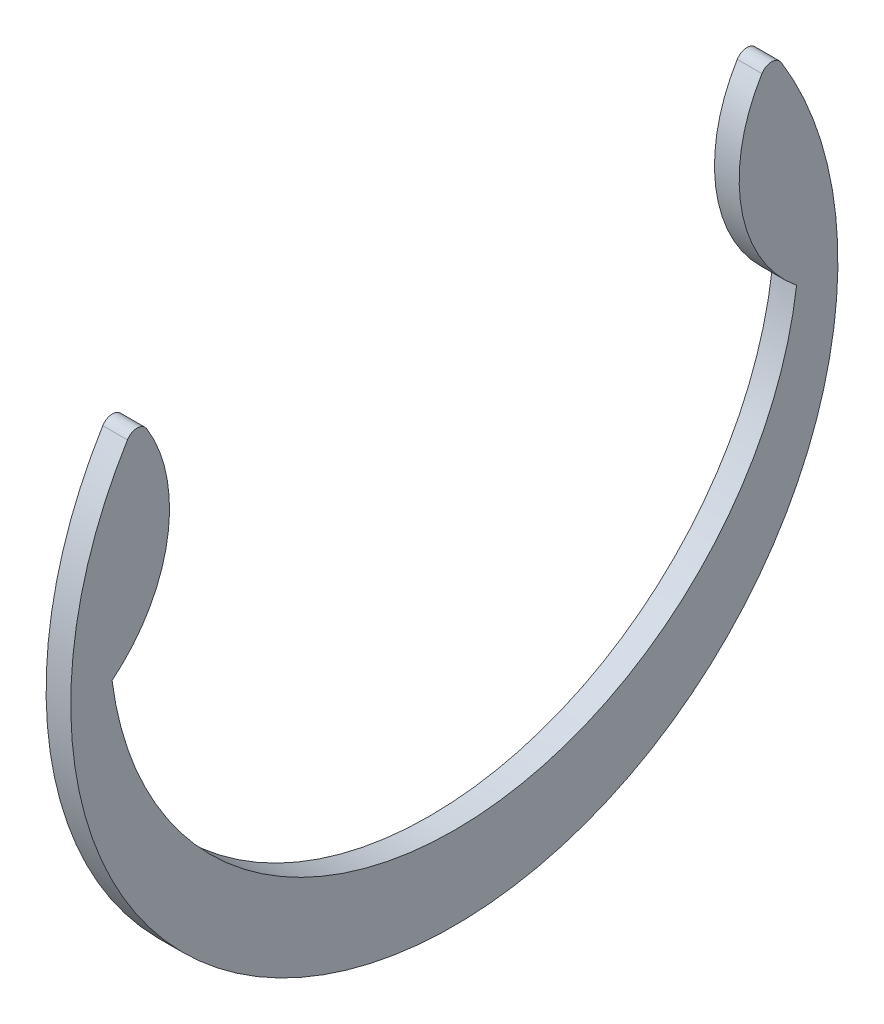
ISO-10303-21;
HEADER;
FILE_DESCRIPTION(('STEP AP214'),'2;1');
FILE_NAME('part.step','',(''),(''),'','','');
FILE_SCHEMA(('AUTOMOTIVE_DESIGN { 1 0 10303 214 1 1 1 1 }'));
ENDSEC;
DATA;
#1=APPLICATION_CONTEXT('core data for automotive mechanical design processes');
#2=APPLICATION_PROTOCOL_DEFINITION('international standard','automotive_design',2000,#1);
#3=PRODUCT_CONTEXT('',#1,'mechanical');
#4=PRODUCT('Part','Part','',(#3));
#5=PRODUCT_RELATED_PRODUCT_CATEGORY('part','',(#4));
#6=PRODUCT_DEFINITION_FORMATION('','',#4);
#7=PRODUCT_DEFINITION_CONTEXT('part definition',#1,'design');
#8=PRODUCT_DEFINITION('design','',#6,#7);
#9=PRODUCT_DEFINITION_SHAPE('','',#8);
#10=(LENGTH_UNIT() NAMED_UNIT(*) SI_UNIT(.MILLI.,.METRE.));
#11=(NAMED_UNIT(*) PLANE_ANGLE_UNIT() SI_UNIT($,.RADIAN.));
#12=(NAMED_UNIT(*) SI_UNIT($,.STERADIAN.) SOLID_ANGLE_UNIT());
#13=UNCERTAINTY_MEASURE_WITH_UNIT(LENGTH_MEASURE(1.E-05),#10,'distance_accuracy_value','');
#14=(GEOMETRIC_REPRESENTATION_CONTEXT(3) GLOBAL_UNCERTAINTY_ASSIGNED_CONTEXT((#13)) GLOBAL_UNIT_ASSIGNED_CONTEXT((#10,
#11,#12)) REPRESENTATION_CONTEXT('',''));
#15=CARTESIAN_POINT('',(0.,0.,0.));
#16=DIRECTION('',(0.,0.,1.));
#17=DIRECTION('',(1.,0.,0.));
#18=AXIS2_PLACEMENT_3D('',#15,#16,#17);
#19=CARTESIAN_POINT('',(0.635,6.17944168403095,22.5999861970108));
#20=DIRECTION('',(-1.,0.,0.));
#21=DIRECTION('',(0.,0.,1.));
#22=AXIS2_PLACEMENT_3D('',#19,#20,#21);
#23=CYLINDRICAL_SURFACE('',#22,7.93557267282992);
#24=CARTESIAN_POINT('',(-0.635,6.17944168403095,22.5999861970108));
#25=DIRECTION('',(1.,0.,0.));
#26=DIRECTION('',(0.,0.,1.));
#27=AXIS2_PLACEMENT_3D('',#24,#25,#26);
#28=CIRCLE('',#27,7.93557267282992);
#29=CARTESIAN_POINT('',(-0.635,0.,17.62125));
#30=VERTEX_POINT('',#29);
#31=CARTESIAN_POINT('',(-0.635,10.3292728157641,15.8359478156987));
#32=VERTEX_POINT('',#31);
#33=EDGE_CURVE('E120',#30,#32,#28,.T.);
#34=ORIENTED_EDGE('',*,*,#33,.T.);
#35=DIRECTION('',(-1.,0.,0.));
#36=VECTOR('',#35,1.);
#37=CARTESIAN_POINT('',(0.635,10.3292728157641,15.8359478156987));
#38=LINE('',#37,#36);
#39=CARTESIAN_POINT('',(0.635,10.3292728157641,15.8359478156987));
#40=VERTEX_POINT('',#39);
#41=EDGE_CURVE('E11',#40,#32,#38,.T.);
#42=ORIENTED_EDGE('',*,*,#41,.F.);
#43=CARTESIAN_POINT('',(0.635,6.17944168403095,22.5999861970108));
#44=DIRECTION('',(1.,0.,0.));
#45=DIRECTION('',(0.,0.,1.));
#46=AXIS2_PLACEMENT_3D('',#43,#44,#45);
#47=CIRCLE('',#46,7.93557267282992);
#48=CARTESIAN_POINT('',(0.635,0.,17.62125));
#49=VERTEX_POINT('',#48);
#50=EDGE_CURVE('E130',#49,#40,#47,.T.);
#51=ORIENTED_EDGE('',*,*,#50,.F.);
#52=DIRECTION('',(-1.,0.,0.));
#53=VECTOR('',#52,1.);
#54=CARTESIAN_POINT('',(0.635,0.,17.62125));
#55=LINE('',#54,#53);
#56=EDGE_CURVE('E116',#49,#30,#55,.T.);
#57=ORIENTED_EDGE('',*,*,#56,.T.);
#58=EDGE_LOOP('',(#34,#42,#51,#57));
#59=FACE_BOUND('',#58,.T.);
#60=ADVANCED_FACE('F36',(#59),#23,.T.);
#61=CARTESIAN_POINT('',(0.635,10.023789326672,16.3338721840604));
#62=DIRECTION('',(-1.,0.,0.));
#63=DIRECTION('',(0.,0.,1.));
#64=AXIS2_PLACEMENT_3D('',#61,#62,#63);
#65=CYLINDRICAL_SURFACE('',#64,0.584165078309483);
#66=CARTESIAN_POINT('',(-0.635,10.023789326672,16.3338721840604));
#67=DIRECTION('',(1.,0.,0.));
#68=DIRECTION('',(0.,0.,1.));
#69=AXIS2_PLACEMENT_3D('',#66,#67,#68);
#70=CIRCLE('',#69,0.584165078309483);
#71=CARTESIAN_POINT('',(-0.635,10.3293333333333,16.8317594189939));
#72=VERTEX_POINT('',#71);
#73=EDGE_CURVE('E123',#32,#72,#70,.T.);
#74=ORIENTED_EDGE('',*,*,#73,.T.);
#75=DIRECTION('',(-1.,0.,0.));
#76=VECTOR('',#75,1.);
#77=CARTESIAN_POINT('',(0.635,10.3293333333333,16.8317594189939));
#78=LINE('',#77,#76);
#79=CARTESIAN_POINT('',(0.635,10.3293333333333,16.8317594189939));
#80=VERTEX_POINT('',#79);
#81=EDGE_CURVE('E44',#80,#72,#78,.T.);
#82=ORIENTED_EDGE('',*,*,#81,.F.);
#83=CARTESIAN_POINT('',(0.635,10.023789326672,16.3338721840604));
#84=DIRECTION('',(1.,0.,0.));
#85=DIRECTION('',(0.,0.,1.));
#86=AXIS2_PLACEMENT_3D('',#83,#84,#85);
#87=CIRCLE('',#86,0.584165078309483);
#88=EDGE_CURVE('E89',#40,#80,#87,.T.);
#89=ORIENTED_EDGE('',*,*,#88,.F.);
#90=ORIENTED_EDGE('',*,*,#41,.T.);
#91=EDGE_LOOP('',(#74,#82,#89,#90));
#92=FACE_BOUND('',#91,.T.);
#93=ADVANCED_FACE('F154',(#92),#65,.T.);
#94=CARTESIAN_POINT('',(0.635,0.,0.));
#95=DIRECTION('',(-1.,0.,0.));
#96=DIRECTION('',(0.,0.,1.));
#97=AXIS2_PLACEMENT_3D('',#94,#95,#96);
#98=CYLINDRICAL_SURFACE('',#97,19.7485);
#99=CARTESIAN_POINT('',(-0.635,0.,0.));
#100=DIRECTION('',(1.,0.,0.));
#101=DIRECTION('',(0.,0.,1.));
#102=AXIS2_PLACEMENT_3D('',#99,#100,#101);
#103=CIRCLE('',#102,19.7485);
#104=CARTESIAN_POINT('',(-0.635,10.3293333333333,-16.8317594189939));
#105=VERTEX_POINT('',#104);
#106=EDGE_CURVE('E125',#72,#105,#103,.T.);
#107=ORIENTED_EDGE('',*,*,#106,.T.);
#108=DIRECTION('',(-1.,0.,0.));
#109=VECTOR('',#108,1.);
#110=CARTESIAN_POINT('',(0.635,10.3293333333333,-16.8317594189939));
#111=LINE('',#110,#109);
#112=CARTESIAN_POINT('',(0.635,10.3293333333333,-16.8317594189939));
#113=VERTEX_POINT('',#112);
#114=EDGE_CURVE('E111',#113,#105,#111,.T.);
#115=ORIENTED_EDGE('',*,*,#114,.F.);
#116=CARTESIAN_POINT('',(0.635,0.,0.));
#117=DIRECTION('',(1.,0.,0.));
#118=DIRECTION('',(0.,0.,1.));
#119=AXIS2_PLACEMENT_3D('',#116,#117,#118);
#120=CIRCLE('',#119,19.7485);
#121=EDGE_CURVE('E102',#80,#113,#120,.T.);
#122=ORIENTED_EDGE('',*,*,#121,.F.);
#123=ORIENTED_EDGE('',*,*,#81,.T.);
#124=EDGE_LOOP('',(#107,#115,#122,#123));
#125=FACE_BOUND('',#124,.T.);
#126=ADVANCED_FACE('F136',(#125),#98,.T.);
#127=CARTESIAN_POINT('',(0.635,10.023789326672,-16.3338721840604));
#128=DIRECTION('',(-1.,0.,0.));
#129=DIRECTION('',(0.,0.,1.));
#130=AXIS2_PLACEMENT_3D('',#127,#128,#129);
#131=CYLINDRICAL_SURFACE('',#130,0.584165078309483);
#132=CARTESIAN_POINT('',(-0.635,10.023789326672,-16.3338721840604));
#133=DIRECTION('',(1.,0.,0.));
#134=DIRECTION('',(0.,0.,-1.));
#135=AXIS2_PLACEMENT_3D('',#132,#133,#134);
#136=CIRCLE('',#135,0.584165078309483);
#137=CARTESIAN_POINT('',(-0.635,10.3292728157641,-15.8359478156987));
#138=VERTEX_POINT('',#137);
#139=EDGE_CURVE('E110',#105,#138,#136,.T.);
#140=ORIENTED_EDGE('',*,*,#139,.T.);
#141=DIRECTION('',(-1.,0.,0.));
#142=VECTOR('',#141,1.);
#143=CARTESIAN_POINT('',(0.635,10.3292728157641,-15.8359478156987));
#144=LINE('',#143,#142);
#145=CARTESIAN_POINT('',(0.635,10.3292728157641,-15.8359478156987));
#146=VERTEX_POINT('',#145);
#147=EDGE_CURVE('E107',#146,#138,#144,.T.);
#148=ORIENTED_EDGE('',*,*,#147,.F.);
#149=CARTESIAN_POINT('',(0.635,10.023789326672,-16.3338721840604));
#150=DIRECTION('',(1.,0.,0.));
#151=DIRECTION('',(0.,0.,-1.));
#152=AXIS2_PLACEMENT_3D('',#149,#150,#151);
#153=CIRCLE('',#152,0.584165078309483);
#154=EDGE_CURVE('E96',#113,#146,#153,.T.);
#155=ORIENTED_EDGE('',*,*,#154,.F.);
#156=ORIENTED_EDGE('',*,*,#114,.T.);
#157=EDGE_LOOP('',(#140,#148,#155,#156));
#158=FACE_BOUND('',#157,.T.);
#159=ADVANCED_FACE('F108',(#158),#131,.T.);
#160=CARTESIAN_POINT('',(0.635,6.17944168403095,-22.5999861970108));
#161=DIRECTION('',(-1.,0.,0.));
#162=DIRECTION('',(0.,0.,1.));
#163=AXIS2_PLACEMENT_3D('',#160,#161,#162);
#164=CYLINDRICAL_SURFACE('',#163,7.93557267282992);
#165=CARTESIAN_POINT('',(-0.635,6.17944168403095,-22.5999861970108));
#166=DIRECTION('',(1.,0.,0.));
#167=DIRECTION('',(0.,0.,1.));
#168=AXIS2_PLACEMENT_3D('',#165,#166,#167);
#169=CIRCLE('',#168,7.93557267282992);
#170=CARTESIAN_POINT('',(-0.635,0.,-17.62125));
#171=VERTEX_POINT('',#170);
#172=EDGE_CURVE('E75',#138,#171,#169,.T.);
#173=ORIENTED_EDGE('',*,*,#172,.T.);
#174=DIRECTION('',(-1.,0.,0.));
#175=VECTOR('',#174,1.);
#176=CARTESIAN_POINT('',(0.635,0.,-17.62125));
#177=LINE('',#176,#175);
#178=CARTESIAN_POINT('',(0.635,0.,-17.62125));
#179=VERTEX_POINT('',#178);
#180=EDGE_CURVE('E112',#179,#171,#177,.T.);
#181=ORIENTED_EDGE('',*,*,#180,.F.);
#182=CARTESIAN_POINT('',(0.635,6.17944168403095,-22.5999861970108));
#183=DIRECTION('',(1.,0.,0.));
#184=DIRECTION('',(0.,0.,1.));
#185=AXIS2_PLACEMENT_3D('',#182,#183,#184);
#186=CIRCLE('',#185,7.93557267282992);
#187=EDGE_CURVE('E100',#146,#179,#186,.T.);
#188=ORIENTED_EDGE('',*,*,#187,.F.);
#189=ORIENTED_EDGE('',*,*,#147,.T.);
#190=EDGE_LOOP('',(#173,#181,#188,#189));
#191=FACE_BOUND('',#190,.T.);
#192=ADVANCED_FACE('F114',(#191),#164,.T.);
#193=CARTESIAN_POINT('',(0.635,2.27328048155738,0.));
#194=DIRECTION('',(-1.,0.,0.));
#195=DIRECTION('',(0.,0.,1.));
#196=AXIS2_PLACEMENT_3D('',#193,#194,#195);
#197=CYLINDRICAL_SURFACE('',#196,17.7672804815574);
#198=CARTESIAN_POINT('',(-0.635,2.27328048155738,0.));
#199=DIRECTION('',(-1.,0.,0.));
#200=DIRECTION('',(0.,0.,-1.));
#201=AXIS2_PLACEMENT_3D('',#198,#199,#200);
#202=CIRCLE('',#201,17.7672804815574);
#203=EDGE_CURVE('E81',#171,#30,#202,.T.);
#204=ORIENTED_EDGE('',*,*,#203,.T.);
#205=ORIENTED_EDGE('',*,*,#56,.F.);
#206=CARTESIAN_POINT('',(0.635,2.27328048155738,0.));
#207=DIRECTION('',(-1.,0.,0.));
#208=DIRECTION('',(0.,0.,-1.));
#209=AXIS2_PLACEMENT_3D('',#206,#207,#208);
#210=CIRCLE('',#209,17.7672804815574);
#211=EDGE_CURVE('E52',#179,#49,#210,.T.);
#212=ORIENTED_EDGE('',*,*,#211,.F.);
#213=ORIENTED_EDGE('',*,*,#180,.T.);
#214=EDGE_LOOP('',(#204,#205,#212,#213));
#215=FACE_BOUND('',#214,.T.);
#216=ADVANCED_FACE('F143',(#215),#197,.F.);
#217=CARTESIAN_POINT('',(0.635,4.22636108279417,11.2999930985054));
#218=DIRECTION('',(-1.,0.,0.));
#219=DIRECTION('',(0.,0.,1.));
#220=AXIS2_PLACEMENT_3D('',#217,#218,#219);
#221=PLANE('',#220);
#222=ORIENTED_EDGE('',*,*,#50,.T.);
#223=ORIENTED_EDGE('',*,*,#88,.T.);
#224=ORIENTED_EDGE('',*,*,#121,.T.);
#225=ORIENTED_EDGE('',*,*,#154,.T.);
#226=ORIENTED_EDGE('',*,*,#187,.T.);
#227=ORIENTED_EDGE('',*,*,#211,.T.);
#228=EDGE_LOOP('',(#222,#223,#224,#225,#226,#227));
#229=FACE_BOUND('',#228,.T.);
#230=ADVANCED_FACE('F98',(#229),#221,.F.);
#231=CARTESIAN_POINT('',(-0.635,4.22636108279417,11.2999930985054));
#232=DIRECTION('',(-1.,0.,0.));
#233=DIRECTION('',(0.,0.,1.));
#234=AXIS2_PLACEMENT_3D('',#231,#232,#233);
#235=PLANE('',#234);
#236=ORIENTED_EDGE('',*,*,#33,.F.);
#237=ORIENTED_EDGE('',*,*,#203,.F.);
#238=ORIENTED_EDGE('',*,*,#172,.F.);
#239=ORIENTED_EDGE('',*,*,#139,.F.);
#240=ORIENTED_EDGE('',*,*,#106,.F.);
#241=ORIENTED_EDGE('',*,*,#73,.F.);
#242=EDGE_LOOP('',(#236,#237,#238,#239,#240,#241));
#243=FACE_BOUND('',#242,.T.);
#244=ADVANCED_FACE('F139',(#243),#235,.T.);
#245=CLOSED_SHELL('',(#60,#93,#126,#159,#192,#216,#230,#244));
#246=MANIFOLD_SOLID_BREP('B2',#245);
#247=ADVANCED_BREP_SHAPE_REPRESENTATION('',(#18,#246),#14);
#248=SHAPE_DEFINITION_REPRESENTATION(#9,#247);
ENDSEC;
END-ISO-10303-21;
